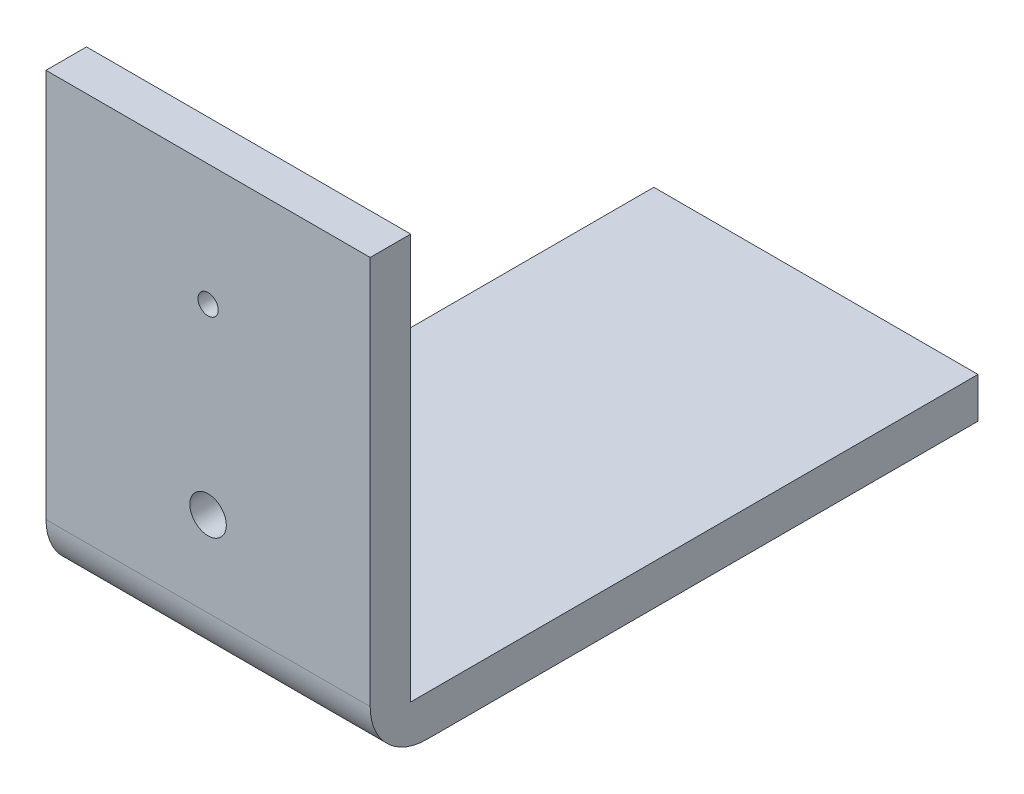
ISO-10303-21;
HEADER;
FILE_DESCRIPTION(('STEP AP214'),'2;1');
FILE_NAME('part.step','',(''),(''),'','','');
FILE_SCHEMA(('AUTOMOTIVE_DESIGN { 1 0 10303 214 1 1 1 1 }'));
ENDSEC;
DATA;
#1=APPLICATION_CONTEXT('core data for automotive mechanical design processes');
#2=APPLICATION_PROTOCOL_DEFINITION('international standard','automotive_design',2000,#1);
#3=PRODUCT_CONTEXT('',#1,'mechanical');
#4=PRODUCT('Part','Part','',(#3));
#5=PRODUCT_RELATED_PRODUCT_CATEGORY('part','',(#4));
#6=PRODUCT_DEFINITION_FORMATION('','',#4);
#7=PRODUCT_DEFINITION_CONTEXT('part definition',#1,'design');
#8=PRODUCT_DEFINITION('design','',#6,#7);
#9=PRODUCT_DEFINITION_SHAPE('','',#8);
#10=(LENGTH_UNIT() NAMED_UNIT(*) SI_UNIT(.MILLI.,.METRE.));
#11=(NAMED_UNIT(*) PLANE_ANGLE_UNIT() SI_UNIT($,.RADIAN.));
#12=(NAMED_UNIT(*) SI_UNIT($,.STERADIAN.) SOLID_ANGLE_UNIT());
#13=UNCERTAINTY_MEASURE_WITH_UNIT(LENGTH_MEASURE(1.E-05),#10,'distance_accuracy_value','');
#14=(GEOMETRIC_REPRESENTATION_CONTEXT(3) GLOBAL_UNCERTAINTY_ASSIGNED_CONTEXT((#13)) GLOBAL_UNIT_ASSIGNED_CONTEXT((#10,
#11,#12)) REPRESENTATION_CONTEXT('',''));
#15=CARTESIAN_POINT('',(0.,0.,0.));
#16=DIRECTION('',(0.,0.,1.));
#17=DIRECTION('',(1.,0.,0.));
#18=AXIS2_PLACEMENT_3D('',#15,#16,#17);
#19=CARTESIAN_POINT('',(-15.5608591885442,15.8472553699284,5.));
#20=DIRECTION('',(1.,0.,0.));
#21=DIRECTION('',(0.,1.,0.));
#22=AXIS2_PLACEMENT_3D('',#19,#20,#21);
#23=PLANE('',#22);
#24=DIRECTION('',(0.,0.,-1.));
#25=VECTOR('',#24,1.);
#26=CARTESIAN_POINT('',(-15.5608591885441,-39.1527446300716,5.));
#27=LINE('',#26,#25);
#28=CARTESIAN_POINT('',(-15.5608591885441,-39.1527446300716,-2.));
#29=VERTEX_POINT('',#28);
#30=CARTESIAN_POINT('',(-15.5608591885441,-39.1527446300716,-70.));
#31=VERTEX_POINT('',#30);
#32=EDGE_CURVE('E102',#29,#31,#27,.T.);
#33=ORIENTED_EDGE('',*,*,#32,.F.);
#34=CARTESIAN_POINT('',(-15.5608591885441,-32.1527446300716,-2.));
#35=DIRECTION('',(1.,0.,0.));
#36=DIRECTION('',(0.,1.,0.));
#37=AXIS2_PLACEMENT_3D('',#34,#35,#36);
#38=CIRCLE('',#37,7.);
#39=CARTESIAN_POINT('',(-15.5608591885441,-32.1527446300716,5.));
#40=VERTEX_POINT('',#39);
#41=EDGE_CURVE('E67',#29,#40,#38,.F.);
#42=ORIENTED_EDGE('',*,*,#41,.T.);
#43=DIRECTION('',(0.,-1.,0.));
#44=VECTOR('',#43,1.);
#45=CARTESIAN_POINT('',(-15.5608591885442,15.8472553699284,5.));
#46=LINE('',#45,#44);
#47=CARTESIAN_POINT('',(-15.5608591885442,15.8472553699284,5.));
#48=VERTEX_POINT('',#47);
#49=EDGE_CURVE('E151',#48,#40,#46,.T.);
#50=ORIENTED_EDGE('',*,*,#49,.F.);
#51=DIRECTION('',(0.,0.,-1.));
#52=VECTOR('',#51,1.);
#53=CARTESIAN_POINT('',(-15.5608591885442,15.8472553699284,5.));
#54=LINE('',#53,#52);
#55=CARTESIAN_POINT('',(-15.5608591885442,15.8472553699284,0.));
#56=VERTEX_POINT('',#55);
#57=EDGE_CURVE('E161',#48,#56,#54,.T.);
#58=ORIENTED_EDGE('',*,*,#57,.T.);
#59=DIRECTION('',(0.,-1.,0.));
#60=VECTOR('',#59,1.);
#61=CARTESIAN_POINT('',(-15.5608591885442,15.8472553699284,0.));
#62=LINE('',#61,#60);
#63=CARTESIAN_POINT('',(-15.5608591885441,-34.1527446300716,0.));
#64=VERTEX_POINT('',#63);
#65=EDGE_CURVE('E143',#56,#64,#62,.T.);
#66=ORIENTED_EDGE('',*,*,#65,.T.);
#67=DIRECTION('',(0.,0.,-1.));
#68=VECTOR('',#67,1.);
#69=CARTESIAN_POINT('',(-15.5608591885441,-34.1527446300716,5.));
#70=LINE('',#69,#68);
#71=CARTESIAN_POINT('',(-15.5608591885441,-34.1527446300716,-70.));
#72=VERTEX_POINT('',#71);
#73=EDGE_CURVE('E126',#64,#72,#70,.T.);
#74=ORIENTED_EDGE('',*,*,#73,.T.);
#75=DIRECTION('',(0.,1.,0.));
#76=VECTOR('',#75,1.);
#77=CARTESIAN_POINT('',(-15.5608591885441,-39.1527446300716,-70.));
#78=LINE('',#77,#76);
#79=EDGE_CURVE('E117',#31,#72,#78,.T.);
#80=ORIENTED_EDGE('',*,*,#79,.F.);
#81=EDGE_LOOP('',(#33,#42,#50,#58,#66,#74,#80));
#82=FACE_BOUND('',#81,.T.);
#83=ADVANCED_FACE('F44',(#82),#23,.F.);
#84=CARTESIAN_POINT('',(24.4391408114559,15.8472553699284,5.));
#85=DIRECTION('',(-1.,0.,0.));
#86=DIRECTION('',(0.,-1.,0.));
#87=AXIS2_PLACEMENT_3D('',#84,#85,#86);
#88=PLANE('',#87);
#89=DIRECTION('',(0.,1.,0.));
#90=VECTOR('',#89,1.);
#91=CARTESIAN_POINT('',(24.4391408114559,15.8472553699284,5.));
#92=LINE('',#91,#90);
#93=CARTESIAN_POINT('',(24.4391408114559,-32.1527446300716,5.));
#94=VERTEX_POINT('',#93);
#95=CARTESIAN_POINT('',(24.4391408114559,15.8472553699284,5.));
#96=VERTEX_POINT('',#95);
#97=EDGE_CURVE('E154',#94,#96,#92,.T.);
#98=ORIENTED_EDGE('',*,*,#97,.F.);
#99=CARTESIAN_POINT('',(24.4391408114559,-32.1527446300716,-2.));
#100=DIRECTION('',(-1.,0.,0.));
#101=DIRECTION('',(0.,-1.,0.));
#102=AXIS2_PLACEMENT_3D('',#99,#100,#101);
#103=CIRCLE('',#102,7.);
#104=CARTESIAN_POINT('',(24.4391408114559,-39.1527446300716,-2.));
#105=VERTEX_POINT('',#104);
#106=EDGE_CURVE('E11',#94,#105,#103,.F.);
#107=ORIENTED_EDGE('',*,*,#106,.T.);
#108=DIRECTION('',(0.,0.,1.));
#109=VECTOR('',#108,1.);
#110=CARTESIAN_POINT('',(24.4391408114559,-39.1527446300716,5.));
#111=LINE('',#110,#109);
#112=CARTESIAN_POINT('',(24.4391408114559,-39.1527446300716,-70.));
#113=VERTEX_POINT('',#112);
#114=EDGE_CURVE('E122',#113,#105,#111,.T.);
#115=ORIENTED_EDGE('',*,*,#114,.F.);
#116=DIRECTION('',(0.,1.,0.));
#117=VECTOR('',#116,1.);
#118=CARTESIAN_POINT('',(24.4391408114559,-39.1527446300716,-70.));
#119=LINE('',#118,#117);
#120=CARTESIAN_POINT('',(24.4391408114559,-34.1527446300716,-70.));
#121=VERTEX_POINT('',#120);
#122=EDGE_CURVE('E119',#113,#121,#119,.T.);
#123=ORIENTED_EDGE('',*,*,#122,.T.);
#124=DIRECTION('',(0.,0.,1.));
#125=VECTOR('',#124,1.);
#126=CARTESIAN_POINT('',(24.4391408114559,-34.1527446300716,5.));
#127=LINE('',#126,#125);
#128=CARTESIAN_POINT('',(24.4391408114559,-34.1527446300716,0.));
#129=VERTEX_POINT('',#128);
#130=EDGE_CURVE('E112',#121,#129,#127,.T.);
#131=ORIENTED_EDGE('',*,*,#130,.T.);
#132=DIRECTION('',(0.,1.,0.));
#133=VECTOR('',#132,1.);
#134=CARTESIAN_POINT('',(24.4391408114559,15.8472553699284,0.));
#135=LINE('',#134,#133);
#136=CARTESIAN_POINT('',(24.4391408114559,15.8472553699284,0.));
#137=VERTEX_POINT('',#136);
#138=EDGE_CURVE('E168',#129,#137,#135,.T.);
#139=ORIENTED_EDGE('',*,*,#138,.T.);
#140=DIRECTION('',(0.,0.,-1.));
#141=VECTOR('',#140,1.);
#142=CARTESIAN_POINT('',(24.4391408114559,15.8472553699284,5.));
#143=LINE('',#142,#141);
#144=EDGE_CURVE('E176',#96,#137,#143,.T.);
#145=ORIENTED_EDGE('',*,*,#144,.F.);
#146=EDGE_LOOP('',(#98,#107,#115,#123,#131,#139,#145));
#147=FACE_BOUND('',#146,.T.);
#148=ADVANCED_FACE('F205',(#147),#88,.F.);
#149=CARTESIAN_POINT('',(-15.5608591885442,15.8472553699284,5.));
#150=DIRECTION('',(0.,-1.,0.));
#151=DIRECTION('',(0.,0.,-1.));
#152=AXIS2_PLACEMENT_3D('',#149,#150,#151);
#153=PLANE('',#152);
#154=DIRECTION('',(-1.,0.,0.));
#155=VECTOR('',#154,1.);
#156=CARTESIAN_POINT('',(-15.5608591885442,15.8472553699284,0.));
#157=LINE('',#156,#155);
#158=EDGE_CURVE('E155',#137,#56,#157,.T.);
#159=ORIENTED_EDGE('',*,*,#158,.T.);
#160=ORIENTED_EDGE('',*,*,#57,.F.);
#161=DIRECTION('',(-1.,0.,0.));
#162=VECTOR('',#161,1.);
#163=CARTESIAN_POINT('',(-15.5608591885442,15.8472553699284,5.));
#164=LINE('',#163,#162);
#165=EDGE_CURVE('E158',#96,#48,#164,.T.);
#166=ORIENTED_EDGE('',*,*,#165,.F.);
#167=ORIENTED_EDGE('',*,*,#144,.T.);
#168=EDGE_LOOP('',(#159,#160,#166,#167));
#169=FACE_BOUND('',#168,.T.);
#170=ADVANCED_FACE('F188',(#169),#153,.F.);
#171=CARTESIAN_POINT('',(0.,0.,5.));
#172=DIRECTION('',(0.,0.,1.));
#173=DIRECTION('',(1.,0.,0.));
#174=AXIS2_PLACEMENT_3D('',#171,#172,#173);
#175=PLANE('',#174);
#176=CARTESIAN_POINT('',(4.43914081145585,0.847255369928406,5.));
#177=DIRECTION('',(0.,0.,1.));
#178=DIRECTION('',(1.,0.,0.));
#179=AXIS2_PLACEMENT_3D('',#176,#177,#178);
#180=CIRCLE('',#179,1.25);
#181=CARTESIAN_POINT('',(5.68914081145585,0.847255369928406,5.));
#182=VERTEX_POINT('',#181);
#183=EDGE_CURVE('E144',#182,#182,#180,.T.);
#184=ORIENTED_EDGE('',*,*,#183,.F.);
#185=EDGE_LOOP('',(#184));
#186=FACE_BOUND('',#185,.T.);
#187=CARTESIAN_POINT('',(4.43914081145585,-21.6527446300716,5.));
#188=DIRECTION('',(0.,0.,1.));
#189=DIRECTION('',(1.,0.,0.));
#190=AXIS2_PLACEMENT_3D('',#187,#188,#189);
#191=CIRCLE('',#190,2.25);
#192=CARTESIAN_POINT('',(6.68914081145585,-21.6527446300716,5.));
#193=VERTEX_POINT('',#192);
#194=EDGE_CURVE('E134',#193,#193,#191,.T.);
#195=ORIENTED_EDGE('',*,*,#194,.F.);
#196=EDGE_LOOP('',(#195));
#197=FACE_BOUND('',#196,.T.);
#198=ORIENTED_EDGE('',*,*,#49,.T.);
#199=DIRECTION('',(-1.,0.,0.));
#200=VECTOR('',#199,1.);
#201=CARTESIAN_POINT('',(0.,-32.1527446300716,5.));
#202=LINE('',#201,#200);
#203=EDGE_CURVE('E53',#40,#94,#202,.F.);
#204=ORIENTED_EDGE('',*,*,#203,.T.);
#205=ORIENTED_EDGE('',*,*,#97,.T.);
#206=ORIENTED_EDGE('',*,*,#165,.T.);
#207=EDGE_LOOP('',(#198,#204,#205,#206));
#208=FACE_BOUND('',#207,.T.);
#209=ADVANCED_FACE('F223',(#186,#197,#208),#175,.T.);
#210=CARTESIAN_POINT('',(0.,0.,0.));
#211=DIRECTION('',(0.,0.,1.));
#212=DIRECTION('',(1.,0.,0.));
#213=AXIS2_PLACEMENT_3D('',#210,#211,#212);
#214=PLANE('',#213);
#215=CARTESIAN_POINT('',(4.43914081145585,0.847255369928406,0.));
#216=DIRECTION('',(0.,0.,1.));
#217=DIRECTION('',(1.,0.,0.));
#218=AXIS2_PLACEMENT_3D('',#215,#216,#217);
#219=CIRCLE('',#218,1.25);
#220=CARTESIAN_POINT('',(5.68914081145585,0.847255369928406,0.));
#221=VERTEX_POINT('',#220);
#222=EDGE_CURVE('E139',#221,#221,#219,.T.);
#223=ORIENTED_EDGE('',*,*,#222,.T.);
#224=EDGE_LOOP('',(#223));
#225=FACE_BOUND('',#224,.T.);
#226=CARTESIAN_POINT('',(4.43914081145585,-21.6527446300716,0.));
#227=DIRECTION('',(0.,0.,1.));
#228=DIRECTION('',(1.,0.,0.));
#229=AXIS2_PLACEMENT_3D('',#226,#227,#228);
#230=CIRCLE('',#229,2.25);
#231=CARTESIAN_POINT('',(6.68914081145585,-21.6527446300716,0.));
#232=VERTEX_POINT('',#231);
#233=EDGE_CURVE('E129',#232,#232,#230,.T.);
#234=ORIENTED_EDGE('',*,*,#233,.T.);
#235=EDGE_LOOP('',(#234));
#236=FACE_BOUND('',#235,.T.);
#237=ORIENTED_EDGE('',*,*,#65,.F.);
#238=ORIENTED_EDGE('',*,*,#158,.F.);
#239=ORIENTED_EDGE('',*,*,#138,.F.);
#240=DIRECTION('',(1.,0.,0.));
#241=VECTOR('',#240,1.);
#242=CARTESIAN_POINT('',(-15.5608591885441,-34.1527446300716,0.));
#243=LINE('',#242,#241);
#244=EDGE_CURVE('E164',#64,#129,#243,.T.);
#245=ORIENTED_EDGE('',*,*,#244,.F.);
#246=EDGE_LOOP('',(#237,#238,#239,#245));
#247=FACE_BOUND('',#246,.T.);
#248=ADVANCED_FACE('F193',(#225,#236,#247),#214,.F.);
#249=CARTESIAN_POINT('',(4.43914081145585,-21.6527446300716,0.));
#250=DIRECTION('',(0.,0.,1.));
#251=DIRECTION('',(1.,0.,0.));
#252=AXIS2_PLACEMENT_3D('',#249,#250,#251);
#253=CYLINDRICAL_SURFACE('',#252,2.25);
#254=ORIENTED_EDGE('',*,*,#233,.F.);
#255=EDGE_LOOP('',(#254));
#256=FACE_BOUND('',#255,.T.);
#257=ORIENTED_EDGE('',*,*,#194,.T.);
#258=EDGE_LOOP('',(#257));
#259=FACE_BOUND('',#258,.T.);
#260=ADVANCED_FACE('F226',(#256,#259),#253,.F.);
#261=CARTESIAN_POINT('',(4.43914081145585,0.847255369928406,0.));
#262=DIRECTION('',(0.,0.,1.));
#263=DIRECTION('',(1.,0.,0.));
#264=AXIS2_PLACEMENT_3D('',#261,#262,#263);
#265=CYLINDRICAL_SURFACE('',#264,1.25);
#266=ORIENTED_EDGE('',*,*,#222,.F.);
#267=EDGE_LOOP('',(#266));
#268=FACE_BOUND('',#267,.T.);
#269=ORIENTED_EDGE('',*,*,#183,.T.);
#270=EDGE_LOOP('',(#269));
#271=FACE_BOUND('',#270,.T.);
#272=ADVANCED_FACE('F233',(#268,#271),#265,.F.);
#273=CARTESIAN_POINT('',(0.,-34.1527446300716,0.));
#274=DIRECTION('',(0.,-1.,0.));
#275=DIRECTION('',(0.,0.,-1.));
#276=AXIS2_PLACEMENT_3D('',#273,#274,#275);
#277=PLANE('',#276);
#278=ORIENTED_EDGE('',*,*,#73,.F.);
#279=ORIENTED_EDGE('',*,*,#244,.T.);
#280=ORIENTED_EDGE('',*,*,#130,.F.);
#281=DIRECTION('',(1.,0.,0.));
#282=VECTOR('',#281,1.);
#283=CARTESIAN_POINT('',(-15.5608591885441,-34.1527446300716,-70.));
#284=LINE('',#283,#282);
#285=EDGE_CURVE('E198',#72,#121,#284,.T.);
#286=ORIENTED_EDGE('',*,*,#285,.F.);
#287=EDGE_LOOP('',(#278,#279,#280,#286));
#288=FACE_BOUND('',#287,.T.);
#289=ADVANCED_FACE('F195',(#288),#277,.F.);
#290=CARTESIAN_POINT('',(-15.5608591885441,-39.1527446300716,-70.));
#291=DIRECTION('',(0.,0.,1.));
#292=DIRECTION('',(1.,0.,0.));
#293=AXIS2_PLACEMENT_3D('',#290,#291,#292);
#294=PLANE('',#293);
#295=ORIENTED_EDGE('',*,*,#285,.T.);
#296=ORIENTED_EDGE('',*,*,#122,.F.);
#297=DIRECTION('',(1.,0.,0.));
#298=VECTOR('',#297,1.);
#299=CARTESIAN_POINT('',(-15.5608591885441,-39.1527446300716,-70.));
#300=LINE('',#299,#298);
#301=EDGE_CURVE('E106',#31,#113,#300,.T.);
#302=ORIENTED_EDGE('',*,*,#301,.F.);
#303=ORIENTED_EDGE('',*,*,#79,.T.);
#304=EDGE_LOOP('',(#295,#296,#302,#303));
#305=FACE_BOUND('',#304,.T.);
#306=ADVANCED_FACE('F116',(#305),#294,.F.);
#307=CARTESIAN_POINT('',(0.,-39.1527446300716,0.));
#308=DIRECTION('',(0.,-1.,0.));
#309=DIRECTION('',(0.,0.,-1.));
#310=AXIS2_PLACEMENT_3D('',#307,#308,#309);
#311=PLANE('',#310);
#312=ORIENTED_EDGE('',*,*,#114,.T.);
#313=DIRECTION('',(-1.,0.,0.));
#314=VECTOR('',#313,1.);
#315=CARTESIAN_POINT('',(0.,-39.1527446300716,-2.));
#316=LINE('',#315,#314);
#317=EDGE_CURVE('E109',#105,#29,#316,.T.);
#318=ORIENTED_EDGE('',*,*,#317,.T.);
#319=ORIENTED_EDGE('',*,*,#32,.T.);
#320=ORIENTED_EDGE('',*,*,#301,.T.);
#321=EDGE_LOOP('',(#312,#318,#319,#320));
#322=FACE_BOUND('',#321,.T.);
#323=ADVANCED_FACE('F105',(#322),#311,.T.);
#324=CARTESIAN_POINT('',(0.,-32.1527446300716,-2.));
#325=DIRECTION('',(-1.,0.,0.));
#326=DIRECTION('',(0.,0.,1.));
#327=AXIS2_PLACEMENT_3D('',#324,#325,#326);
#328=CYLINDRICAL_SURFACE('',#327,7.);
#329=ORIENTED_EDGE('',*,*,#106,.F.);
#330=ORIENTED_EDGE('',*,*,#203,.F.);
#331=ORIENTED_EDGE('',*,*,#41,.F.);
#332=ORIENTED_EDGE('',*,*,#317,.F.);
#333=EDGE_LOOP('',(#329,#330,#331,#332));
#334=FACE_BOUND('',#333,.T.);
#335=ADVANCED_FACE('F46',(#334),#328,.T.);
#336=CLOSED_SHELL('',(#83,#148,#170,#209,#248,#260,#272,#289,#306,#323,#335));
#337=MANIFOLD_SOLID_BREP('B2',#336);
#338=ADVANCED_BREP_SHAPE_REPRESENTATION('',(#18,#337),#14);
#339=SHAPE_DEFINITION_REPRESENTATION(#9,#338);
ENDSEC;
END-ISO-10303-21;
